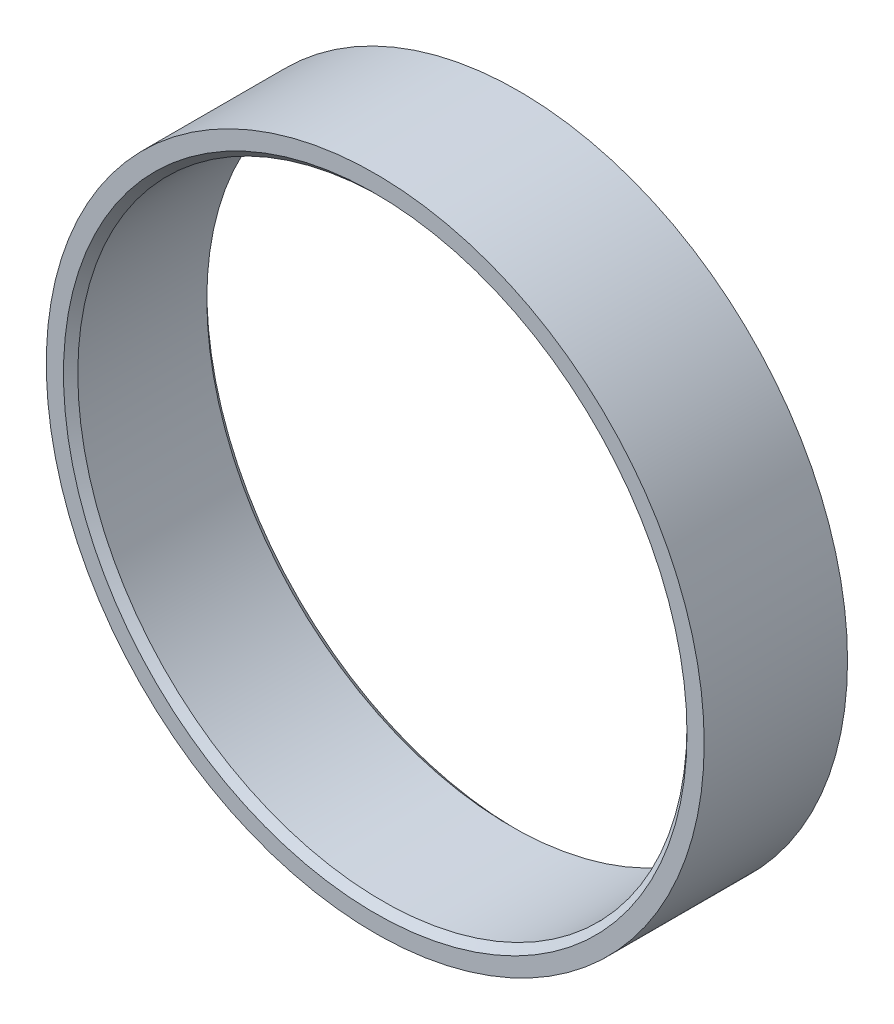
ISO-10303-21;
HEADER;
FILE_DESCRIPTION(('STEP AP214'),'2;1');
FILE_NAME('part.step','',(''),(''),'','','');
FILE_SCHEMA(('AUTOMOTIVE_DESIGN { 1 0 10303 214 1 1 1 1 }'));
ENDSEC;
DATA;
#1=APPLICATION_CONTEXT('core data for automotive mechanical design processes');
#2=APPLICATION_PROTOCOL_DEFINITION('international standard','automotive_design',2000,#1);
#3=PRODUCT_CONTEXT('',#1,'mechanical');
#4=PRODUCT('Part','Part','',(#3));
#5=PRODUCT_RELATED_PRODUCT_CATEGORY('part','',(#4));
#6=PRODUCT_DEFINITION_FORMATION('','',#4);
#7=PRODUCT_DEFINITION_CONTEXT('part definition',#1,'design');
#8=PRODUCT_DEFINITION('design','',#6,#7);
#9=PRODUCT_DEFINITION_SHAPE('','',#8);
#10=(LENGTH_UNIT() NAMED_UNIT(*) SI_UNIT(.MILLI.,.METRE.));
#11=(NAMED_UNIT(*) PLANE_ANGLE_UNIT() SI_UNIT($,.RADIAN.));
#12=(NAMED_UNIT(*) SI_UNIT($,.STERADIAN.) SOLID_ANGLE_UNIT());
#13=UNCERTAINTY_MEASURE_WITH_UNIT(LENGTH_MEASURE(1.E-05),#10,'distance_accuracy_value','');
#14=(GEOMETRIC_REPRESENTATION_CONTEXT(3) GLOBAL_UNCERTAINTY_ASSIGNED_CONTEXT((#13)) GLOBAL_UNIT_ASSIGNED_CONTEXT((#10,
#11,#12)) REPRESENTATION_CONTEXT('',''));
#15=CARTESIAN_POINT('',(0.,0.,0.));
#16=DIRECTION('',(0.,0.,1.));
#17=DIRECTION('',(1.,0.,0.));
#18=AXIS2_PLACEMENT_3D('',#15,#16,#17);
#19=CARTESIAN_POINT('',(0.,0.,-10.));
#20=DIRECTION('',(0.,0.,1.));
#21=DIRECTION('',(1.,0.,0.));
#22=AXIS2_PLACEMENT_3D('',#19,#20,#21);
#23=CYLINDRICAL_SURFACE('',#22,22.95);
#24=CARTESIAN_POINT('',(0.,0.,-10.));
#25=DIRECTION('',(0.,0.,1.));
#26=DIRECTION('',(1.,0.,0.));
#27=AXIS2_PLACEMENT_3D('',#24,#25,#26);
#28=CIRCLE('',#27,22.95);
#29=CARTESIAN_POINT('',(22.95,0.,-10.));
#30=VERTEX_POINT('',#29);
#31=EDGE_CURVE('E60',#30,#30,#28,.T.);
#32=ORIENTED_EDGE('',*,*,#31,.T.);
#33=EDGE_LOOP('',(#32));
#34=FACE_BOUND('',#33,.T.);
#35=CARTESIAN_POINT('',(0.,0.,0.));
#36=DIRECTION('',(0.,0.,1.));
#37=DIRECTION('',(1.,0.,0.));
#38=AXIS2_PLACEMENT_3D('',#35,#36,#37);
#39=CIRCLE('',#38,22.95);
#40=CARTESIAN_POINT('',(22.95,0.,0.));
#41=VERTEX_POINT('',#40);
#42=EDGE_CURVE('E61',#41,#41,#39,.T.);
#43=ORIENTED_EDGE('',*,*,#42,.F.);
#44=EDGE_LOOP('',(#43));
#45=FACE_BOUND('',#44,.T.);
#46=ADVANCED_FACE('F39',(#34,#45),#23,.T.);
#47=CARTESIAN_POINT('',(0.,0.,-10.));
#48=DIRECTION('',(0.,0.,1.));
#49=DIRECTION('',(1.,0.,0.));
#50=AXIS2_PLACEMENT_3D('',#47,#48,#49);
#51=PLANE('',#50);
#52=CARTESIAN_POINT('',(0.,0.,-10.));
#53=DIRECTION('',(0.,0.,1.));
#54=DIRECTION('',(1.,0.,0.));
#55=AXIS2_PLACEMENT_3D('',#52,#53,#54);
#56=CIRCLE('',#55,21.75);
#57=CARTESIAN_POINT('',(21.75,0.,-10.));
#58=VERTEX_POINT('',#57);
#59=EDGE_CURVE('E55',#58,#58,#56,.T.);
#60=ORIENTED_EDGE('',*,*,#59,.T.);
#61=EDGE_LOOP('',(#60));
#62=FACE_BOUND('',#61,.T.);
#63=ORIENTED_EDGE('',*,*,#31,.F.);
#64=EDGE_LOOP('',(#63));
#65=FACE_BOUND('',#64,.T.);
#66=ADVANCED_FACE('F69',(#62,#65),#51,.F.);
#67=CARTESIAN_POINT('',(0.,0.,0.));
#68=DIRECTION('',(0.,0.,1.));
#69=DIRECTION('',(1.,0.,0.));
#70=AXIS2_PLACEMENT_3D('',#67,#68,#69);
#71=PLANE('',#70);
#72=CARTESIAN_POINT('',(0.,0.,0.));
#73=DIRECTION('',(0.,0.,1.));
#74=DIRECTION('',(1.,0.,0.));
#75=AXIS2_PLACEMENT_3D('',#72,#73,#74);
#76=CIRCLE('',#75,21.75);
#77=CARTESIAN_POINT('',(21.75,0.,0.));
#78=VERTEX_POINT('',#77);
#79=EDGE_CURVE('E10',#78,#78,#76,.F.);
#80=ORIENTED_EDGE('',*,*,#79,.T.);
#81=EDGE_LOOP('',(#80));
#82=FACE_BOUND('',#81,.T.);
#83=ORIENTED_EDGE('',*,*,#42,.T.);
#84=EDGE_LOOP('',(#83));
#85=FACE_BOUND('',#84,.T.);
#86=ADVANCED_FACE('F71',(#82,#85),#71,.T.);
#87=CARTESIAN_POINT('',(0.,0.,-10.));
#88=DIRECTION('',(0.,0.,1.));
#89=DIRECTION('',(1.,0.,0.));
#90=AXIS2_PLACEMENT_3D('',#87,#88,#89);
#91=CYLINDRICAL_SURFACE('',#90,21.25);
#92=CARTESIAN_POINT('',(0.,0.,-9.5));
#93=DIRECTION('',(0.,0.,1.));
#94=DIRECTION('',(1.,0.,0.));
#95=AXIS2_PLACEMENT_3D('',#92,#93,#94);
#96=CIRCLE('',#95,21.25);
#97=CARTESIAN_POINT('',(21.25,0.,-9.5));
#98=VERTEX_POINT('',#97);
#99=EDGE_CURVE('E47',#98,#98,#96,.F.);
#100=ORIENTED_EDGE('',*,*,#99,.T.);
#101=EDGE_LOOP('',(#100));
#102=FACE_BOUND('',#101,.T.);
#103=CARTESIAN_POINT('',(0.,0.,-0.499999999999994));
#104=DIRECTION('',(0.,0.,1.));
#105=DIRECTION('',(1.,0.,0.));
#106=AXIS2_PLACEMENT_3D('',#103,#104,#105);
#107=CIRCLE('',#106,21.25);
#108=CARTESIAN_POINT('',(21.25,0.,-0.499999999999994));
#109=VERTEX_POINT('',#108);
#110=EDGE_CURVE('E51',#109,#109,#107,.T.);
#111=ORIENTED_EDGE('',*,*,#110,.T.);
#112=EDGE_LOOP('',(#111));
#113=FACE_BOUND('',#112,.T.);
#114=ADVANCED_FACE('F78',(#102,#113),#91,.F.);
#115=CARTESIAN_POINT('',(0.,0.,-10.));
#116=DIRECTION('',(0.,0.,-1.));
#117=DIRECTION('',(-1.,0.,0.));
#118=AXIS2_PLACEMENT_3D('',#115,#116,#117);
#119=CONICAL_SURFACE('',#118,21.75,0.785398163397441);
#120=ORIENTED_EDGE('',*,*,#99,.F.);
#121=EDGE_LOOP('',(#120));
#122=FACE_BOUND('',#121,.T.);
#123=ORIENTED_EDGE('',*,*,#59,.F.);
#124=EDGE_LOOP('',(#123));
#125=FACE_BOUND('',#124,.T.);
#126=ADVANCED_FACE('F83',(#122,#125),#119,.F.);
#127=CARTESIAN_POINT('',(0.,0.,-0.499999999999994));
#128=DIRECTION('',(0.,0.,1.));
#129=DIRECTION('',(1.,0.,0.));
#130=AXIS2_PLACEMENT_3D('',#127,#128,#129);
#131=CONICAL_SURFACE('',#130,21.25,0.785398163397452);
#132=ORIENTED_EDGE('',*,*,#79,.F.);
#133=EDGE_LOOP('',(#132));
#134=FACE_BOUND('',#133,.T.);
#135=ORIENTED_EDGE('',*,*,#110,.F.);
#136=EDGE_LOOP('',(#135));
#137=FACE_BOUND('',#136,.T.);
#138=ADVANCED_FACE('F42',(#134,#137),#131,.F.);
#139=CLOSED_SHELL('',(#46,#66,#86,#114,#126,#138));
#140=MANIFOLD_SOLID_BREP('B2',#139);
#141=ADVANCED_BREP_SHAPE_REPRESENTATION('',(#18,#140),#14);
#142=SHAPE_DEFINITION_REPRESENTATION(#9,#141);
ENDSEC;
END-ISO-10303-21;
